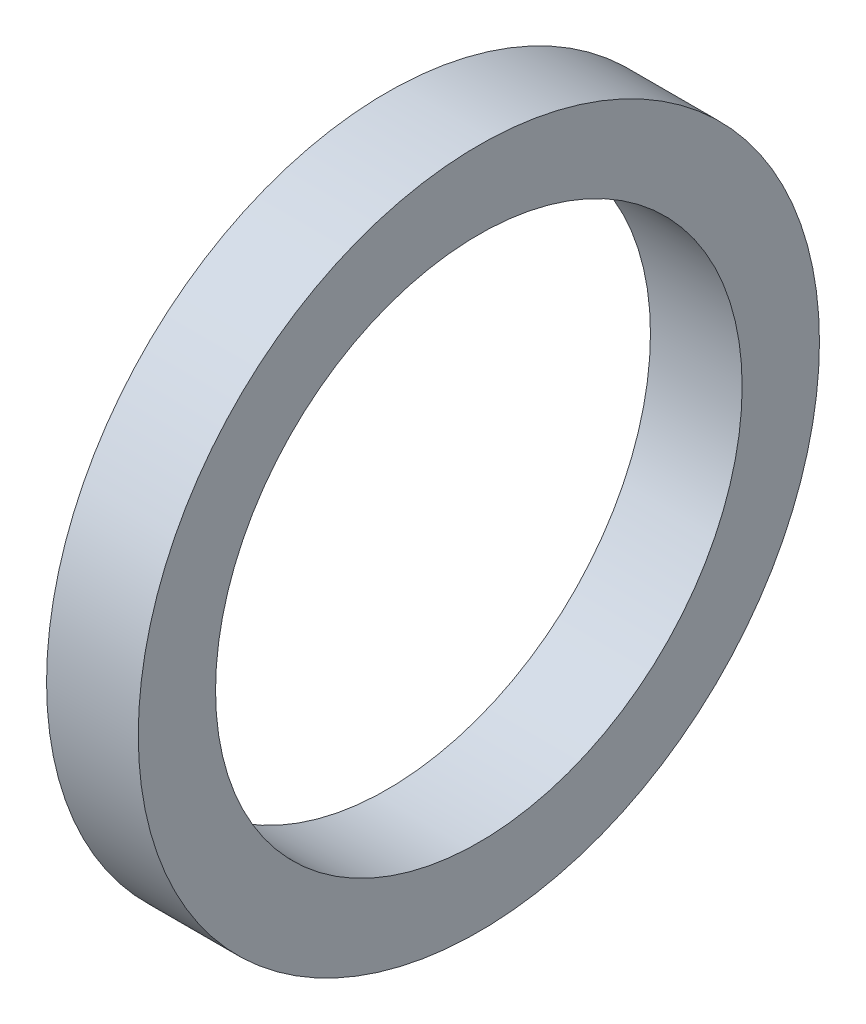
ISO-10303-21;
HEADER;
FILE_DESCRIPTION(('STEP AP214'),'2;1');
FILE_NAME('part.step','',(''),(''),'','','');
FILE_SCHEMA(('AUTOMOTIVE_DESIGN { 1 0 10303 214 1 1 1 1 }'));
ENDSEC;
DATA;
#1=APPLICATION_CONTEXT('core data for automotive mechanical design processes');
#2=APPLICATION_PROTOCOL_DEFINITION('international standard','automotive_design',2000,#1);
#3=PRODUCT_CONTEXT('',#1,'mechanical');
#4=PRODUCT('Part','Part','',(#3));
#5=PRODUCT_RELATED_PRODUCT_CATEGORY('part','',(#4));
#6=PRODUCT_DEFINITION_FORMATION('','',#4);
#7=PRODUCT_DEFINITION_CONTEXT('part definition',#1,'design');
#8=PRODUCT_DEFINITION('design','',#6,#7);
#9=PRODUCT_DEFINITION_SHAPE('','',#8);
#10=(LENGTH_UNIT() NAMED_UNIT(*) SI_UNIT(.MILLI.,.METRE.));
#11=(NAMED_UNIT(*) PLANE_ANGLE_UNIT() SI_UNIT($,.RADIAN.));
#12=(NAMED_UNIT(*) SI_UNIT($,.STERADIAN.) SOLID_ANGLE_UNIT());
#13=UNCERTAINTY_MEASURE_WITH_UNIT(LENGTH_MEASURE(1.E-05),#10,'distance_accuracy_value','');
#14=(GEOMETRIC_REPRESENTATION_CONTEXT(3) GLOBAL_UNCERTAINTY_ASSIGNED_CONTEXT((#13)) GLOBAL_UNIT_ASSIGNED_CONTEXT((#10,
#11,#12)) REPRESENTATION_CONTEXT('',''));
#15=CARTESIAN_POINT('',(0.,0.,0.));
#16=DIRECTION('',(0.,0.,1.));
#17=DIRECTION('',(1.,0.,0.));
#18=AXIS2_PLACEMENT_3D('',#15,#16,#17);
#19=CARTESIAN_POINT('',(7.,0.,0.));
#20=DIRECTION('',(1.,0.,0.));
#21=DIRECTION('',(0.,0.,-1.));
#22=AXIS2_PLACEMENT_3D('',#19,#20,#21);
#23=PLANE('',#22);
#24=CARTESIAN_POINT('',(7.,0.,0.));
#25=DIRECTION('',(1.,0.,0.));
#26=DIRECTION('',(0.,0.,-1.));
#27=AXIS2_PLACEMENT_3D('',#24,#25,#26);
#28=CIRCLE('',#27,26.);
#29=CARTESIAN_POINT('',(7.,0.,-26.));
#30=VERTEX_POINT('',#29);
#31=EDGE_CURVE('E10',#30,#30,#28,.T.);
#32=ORIENTED_EDGE('',*,*,#31,.T.);
#33=EDGE_LOOP('',(#32));
#34=FACE_BOUND('',#33,.T.);
#35=CARTESIAN_POINT('',(7.,0.,0.));
#36=DIRECTION('',(1.,0.,0.));
#37=DIRECTION('',(0.,0.,-1.));
#38=AXIS2_PLACEMENT_3D('',#35,#36,#37);
#39=CIRCLE('',#38,20.1);
#40=CARTESIAN_POINT('',(7.,0.,-20.1));
#41=VERTEX_POINT('',#40);
#42=EDGE_CURVE('E58',#41,#41,#39,.T.);
#43=ORIENTED_EDGE('',*,*,#42,.F.);
#44=EDGE_LOOP('',(#43));
#45=FACE_BOUND('',#44,.T.);
#46=ADVANCED_FACE('F45',(#34,#45),#23,.T.);
#47=CARTESIAN_POINT('',(0.,0.,0.));
#48=DIRECTION('',(1.,0.,0.));
#49=DIRECTION('',(0.,0.,-1.));
#50=AXIS2_PLACEMENT_3D('',#47,#48,#49);
#51=PLANE('',#50);
#52=CARTESIAN_POINT('',(0.,0.,0.));
#53=DIRECTION('',(1.,0.,0.));
#54=DIRECTION('',(0.,0.,-1.));
#55=AXIS2_PLACEMENT_3D('',#52,#53,#54);
#56=CIRCLE('',#55,26.);
#57=CARTESIAN_POINT('',(0.,0.,-26.));
#58=VERTEX_POINT('',#57);
#59=EDGE_CURVE('E49',#58,#58,#56,.T.);
#60=ORIENTED_EDGE('',*,*,#59,.F.);
#61=EDGE_LOOP('',(#60));
#62=FACE_BOUND('',#61,.T.);
#63=CARTESIAN_POINT('',(0.,0.,0.));
#64=DIRECTION('',(1.,0.,0.));
#65=DIRECTION('',(0.,0.,-1.));
#66=AXIS2_PLACEMENT_3D('',#63,#64,#65);
#67=CIRCLE('',#66,20.1);
#68=CARTESIAN_POINT('',(0.,0.,-20.1));
#69=VERTEX_POINT('',#68);
#70=EDGE_CURVE('E60',#69,#69,#67,.T.);
#71=ORIENTED_EDGE('',*,*,#70,.T.);
#72=EDGE_LOOP('',(#71));
#73=FACE_BOUND('',#72,.T.);
#74=ADVANCED_FACE('F72',(#62,#73),#51,.F.);
#75=CARTESIAN_POINT('',(7.,0.,0.));
#76=DIRECTION('',(-1.,0.,0.));
#77=DIRECTION('',(0.,0.,1.));
#78=AXIS2_PLACEMENT_3D('',#75,#76,#77);
#79=CYLINDRICAL_SURFACE('',#78,26.);
#80=ORIENTED_EDGE('',*,*,#31,.F.);
#81=EDGE_LOOP('',(#80));
#82=FACE_BOUND('',#81,.T.);
#83=ORIENTED_EDGE('',*,*,#59,.T.);
#84=EDGE_LOOP('',(#83));
#85=FACE_BOUND('',#84,.T.);
#86=ADVANCED_FACE('F47',(#82,#85),#79,.T.);
#87=CARTESIAN_POINT('',(7.,0.,0.));
#88=DIRECTION('',(-1.,0.,0.));
#89=DIRECTION('',(0.,0.,1.));
#90=AXIS2_PLACEMENT_3D('',#87,#88,#89);
#91=CYLINDRICAL_SURFACE('',#90,20.1);
#92=ORIENTED_EDGE('',*,*,#42,.T.);
#93=EDGE_LOOP('',(#92));
#94=FACE_BOUND('',#93,.T.);
#95=ORIENTED_EDGE('',*,*,#70,.F.);
#96=EDGE_LOOP('',(#95));
#97=FACE_BOUND('',#96,.T.);
#98=ADVANCED_FACE('F68',(#94,#97),#91,.F.);
#99=CLOSED_SHELL('',(#46,#74,#86,#98));
#100=MANIFOLD_SOLID_BREP('B2',#99);
#101=ADVANCED_BREP_SHAPE_REPRESENTATION('',(#18,#100),#14);
#102=SHAPE_DEFINITION_REPRESENTATION(#9,#101);
ENDSEC;
END-ISO-10303-21;
